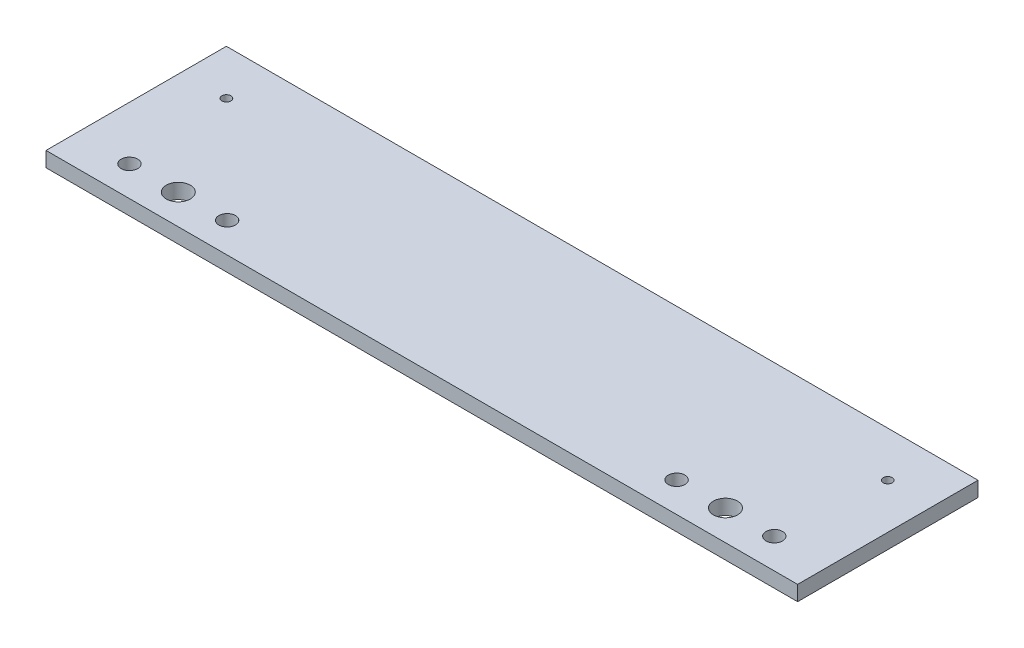
ISO-10303-21;
HEADER;
FILE_DESCRIPTION(('STEP AP214'),'2;1');
FILE_NAME('part.step','',(''),(''),'','','');
FILE_SCHEMA(('AUTOMOTIVE_DESIGN { 1 0 10303 214 1 1 1 1 }'));
ENDSEC;
DATA;
#1=APPLICATION_CONTEXT('core data for automotive mechanical design processes');
#2=APPLICATION_PROTOCOL_DEFINITION('international standard','automotive_design',2000,#1);
#3=PRODUCT_CONTEXT('',#1,'mechanical');
#4=PRODUCT('Part','Part','',(#3));
#5=PRODUCT_RELATED_PRODUCT_CATEGORY('part','',(#4));
#6=PRODUCT_DEFINITION_FORMATION('','',#4);
#7=PRODUCT_DEFINITION_CONTEXT('part definition',#1,'design');
#8=PRODUCT_DEFINITION('design','',#6,#7);
#9=PRODUCT_DEFINITION_SHAPE('','',#8);
#10=(LENGTH_UNIT() NAMED_UNIT(*) SI_UNIT(.MILLI.,.METRE.));
#11=(NAMED_UNIT(*) PLANE_ANGLE_UNIT() SI_UNIT($,.RADIAN.));
#12=(NAMED_UNIT(*) SI_UNIT($,.STERADIAN.) SOLID_ANGLE_UNIT());
#13=UNCERTAINTY_MEASURE_WITH_UNIT(LENGTH_MEASURE(1.E-05),#10,'distance_accuracy_value','');
#14=(GEOMETRIC_REPRESENTATION_CONTEXT(3) GLOBAL_UNCERTAINTY_ASSIGNED_CONTEXT((#13)) GLOBAL_UNIT_ASSIGNED_CONTEXT((#10,
#11,#12)) REPRESENTATION_CONTEXT('',''));
#15=CARTESIAN_POINT('',(0.,0.,0.));
#16=DIRECTION('',(0.,0.,1.));
#17=DIRECTION('',(1.,0.,0.));
#18=AXIS2_PLACEMENT_3D('',#15,#16,#17);
#19=CARTESIAN_POINT('',(0.,5.,0.));
#20=DIRECTION('',(0.,-1.,0.));
#21=DIRECTION('',(0.,0.,-1.));
#22=AXIS2_PLACEMENT_3D('',#19,#20,#21);
#23=PLANE('',#22);
#24=CARTESIAN_POINT('',(74.7499999999999,5.,34.9999999999999));
#25=DIRECTION('',(0.,-1.,0.));
#26=DIRECTION('',(0.,0.,-1.));
#27=AXIS2_PLACEMENT_3D('',#24,#25,#26);
#28=CIRCLE('',#27,2.75);
#29=CARTESIAN_POINT('',(74.7499999999999,5.,32.2499999999999));
#30=VERTEX_POINT('',#29);
#31=EDGE_CURVE('E121',#30,#30,#28,.T.);
#32=ORIENTED_EDGE('',*,*,#31,.T.);
#33=EDGE_LOOP('',(#32));
#34=FACE_BOUND('',#33,.T.);
#35=CARTESIAN_POINT('',(107.25,5.,34.9999999999997));
#36=DIRECTION('',(0.,-1.,0.));
#37=DIRECTION('',(0.,0.,-1.));
#38=AXIS2_PLACEMENT_3D('',#35,#36,#37);
#39=CIRCLE('',#38,2.75000000000001);
#40=CARTESIAN_POINT('',(107.25,5.,32.2499999999996));
#41=VERTEX_POINT('',#40);
#42=EDGE_CURVE('E126',#41,#41,#39,.T.);
#43=ORIENTED_EDGE('',*,*,#42,.T.);
#44=EDGE_LOOP('',(#43));
#45=FACE_BOUND('',#44,.T.);
#46=CARTESIAN_POINT('',(-110.,5.,2.41473507855972E-12));
#47=DIRECTION('',(0.,-1.,0.));
#48=DIRECTION('',(0.,0.,-1.));
#49=AXIS2_PLACEMENT_3D('',#46,#47,#48);
#50=CIRCLE('',#49,1.5);
#51=CARTESIAN_POINT('',(-110.,5.,-1.49999999999758));
#52=VERTEX_POINT('',#51);
#53=EDGE_CURVE('E129',#52,#52,#50,.T.);
#54=ORIENTED_EDGE('',*,*,#53,.T.);
#55=EDGE_LOOP('',(#54));
#56=FACE_BOUND('',#55,.T.);
#57=CARTESIAN_POINT('',(-74.7500000000001,5.,34.9999999999995));
#58=DIRECTION('',(0.,-1.,0.));
#59=DIRECTION('',(0.,0.,-1.));
#60=AXIS2_PLACEMENT_3D('',#57,#58,#59);
#61=CIRCLE('',#60,2.75000000000001);
#62=CARTESIAN_POINT('',(-74.7500000000001,5.,32.2499999999995));
#63=VERTEX_POINT('',#62);
#64=EDGE_CURVE('E132',#63,#63,#61,.T.);
#65=ORIENTED_EDGE('',*,*,#64,.T.);
#66=EDGE_LOOP('',(#65));
#67=FACE_BOUND('',#66,.T.);
#68=CARTESIAN_POINT('',(-107.25,5.,34.9999999999997));
#69=DIRECTION('',(0.,-1.,0.));
#70=DIRECTION('',(0.,0.,-1.));
#71=AXIS2_PLACEMENT_3D('',#68,#69,#70);
#72=CIRCLE('',#71,2.75000000000001);
#73=CARTESIAN_POINT('',(-107.25,5.,32.2499999999997));
#74=VERTEX_POINT('',#73);
#75=EDGE_CURVE('E135',#74,#74,#72,.T.);
#76=ORIENTED_EDGE('',*,*,#75,.T.);
#77=EDGE_LOOP('',(#76));
#78=FACE_BOUND('',#77,.T.);
#79=CARTESIAN_POINT('',(110.,5.,2.27595720048157E-12));
#80=DIRECTION('',(0.,-1.,0.));
#81=DIRECTION('',(0.,0.,-1.));
#82=AXIS2_PLACEMENT_3D('',#79,#80,#81);
#83=CIRCLE('',#82,1.5);
#84=CARTESIAN_POINT('',(110.,5.,-1.49999999999772));
#85=VERTEX_POINT('',#84);
#86=EDGE_CURVE('E138',#85,#85,#83,.T.);
#87=ORIENTED_EDGE('',*,*,#86,.T.);
#88=EDGE_LOOP('',(#87));
#89=FACE_BOUND('',#88,.T.);
#90=DIRECTION('',(0.,0.,-1.));
#91=VECTOR('',#90,1.);
#92=CARTESIAN_POINT('',(125.,5.,45.));
#93=LINE('',#92,#91);
#94=CARTESIAN_POINT('',(125.,5.,45.));
#95=VERTEX_POINT('',#94);
#96=CARTESIAN_POINT('',(125.,5.,-15.));
#97=VERTEX_POINT('',#96);
#98=EDGE_CURVE('E85',#95,#97,#93,.T.);
#99=ORIENTED_EDGE('',*,*,#98,.T.);
#100=DIRECTION('',(-1.,0.,0.));
#101=VECTOR('',#100,1.);
#102=CARTESIAN_POINT('',(-125.,5.,-15.));
#103=LINE('',#102,#101);
#104=CARTESIAN_POINT('',(-125.,5.,-15.));
#105=VERTEX_POINT('',#104);
#106=EDGE_CURVE('E80',#97,#105,#103,.T.);
#107=ORIENTED_EDGE('',*,*,#106,.T.);
#108=DIRECTION('',(0.,0.,1.));
#109=VECTOR('',#108,1.);
#110=CARTESIAN_POINT('',(-125.,5.,45.));
#111=LINE('',#110,#109);
#112=CARTESIAN_POINT('',(-125.,5.,45.));
#113=VERTEX_POINT('',#112);
#114=EDGE_CURVE('E83',#105,#113,#111,.T.);
#115=ORIENTED_EDGE('',*,*,#114,.T.);
#116=DIRECTION('',(1.,0.,0.));
#117=VECTOR('',#116,1.);
#118=CARTESIAN_POINT('',(-125.,5.,45.));
#119=LINE('',#118,#117);
#120=EDGE_CURVE('E50',#113,#95,#119,.T.);
#121=ORIENTED_EDGE('',*,*,#120,.T.);
#122=EDGE_LOOP('',(#99,#107,#115,#121));
#123=FACE_BOUND('',#122,.T.);
#124=CARTESIAN_POINT('',(-91.,5.,35.));
#125=DIRECTION('',(0.,1.,0.));
#126=DIRECTION('',(0.,0.,1.));
#127=AXIS2_PLACEMENT_3D('',#124,#125,#126);
#128=CIRCLE('',#127,4.00000000000001);
#129=CARTESIAN_POINT('',(-91.,5.,39.));
#130=VERTEX_POINT('',#129);
#131=EDGE_CURVE('E100',#130,#130,#128,.T.);
#132=ORIENTED_EDGE('',*,*,#131,.F.);
#133=EDGE_LOOP('',(#132));
#134=FACE_BOUND('',#133,.T.);
#135=CARTESIAN_POINT('',(91.,5.,35.));
#136=DIRECTION('',(0.,1.,0.));
#137=DIRECTION('',(0.,0.,-1.));
#138=AXIS2_PLACEMENT_3D('',#135,#136,#137);
#139=CIRCLE('',#138,4.00000000000001);
#140=CARTESIAN_POINT('',(91.,5.,31.));
#141=VERTEX_POINT('',#140);
#142=EDGE_CURVE('E115',#141,#141,#139,.T.);
#143=ORIENTED_EDGE('',*,*,#142,.F.);
#144=EDGE_LOOP('',(#143));
#145=FACE_BOUND('',#144,.T.);
#146=ADVANCED_FACE('F33',(#34,#45,#56,#67,#78,#89,#123,#134,#145),#23,.F.);
#147=CARTESIAN_POINT('',(0.,0.,0.));
#148=DIRECTION('',(0.,-1.,0.));
#149=DIRECTION('',(0.,0.,-1.));
#150=AXIS2_PLACEMENT_3D('',#147,#148,#149);
#151=PLANE('',#150);
#152=CARTESIAN_POINT('',(74.7499999999999,0.,34.9999999999999));
#153=DIRECTION('',(0.,-1.,0.));
#154=DIRECTION('',(0.,0.,-1.));
#155=AXIS2_PLACEMENT_3D('',#152,#153,#154);
#156=CIRCLE('',#155,2.75);
#157=CARTESIAN_POINT('',(74.7499999999999,0.,32.2499999999999));
#158=VERTEX_POINT('',#157);
#159=EDGE_CURVE('E144',#158,#158,#156,.T.);
#160=ORIENTED_EDGE('',*,*,#159,.F.);
#161=EDGE_LOOP('',(#160));
#162=FACE_BOUND('',#161,.T.);
#163=CARTESIAN_POINT('',(107.25,0.,34.9999999999997));
#164=DIRECTION('',(0.,-1.,0.));
#165=DIRECTION('',(0.,0.,-1.));
#166=AXIS2_PLACEMENT_3D('',#163,#164,#165);
#167=CIRCLE('',#166,2.75000000000001);
#168=CARTESIAN_POINT('',(107.25,0.,32.2499999999996));
#169=VERTEX_POINT('',#168);
#170=EDGE_CURVE('E152',#169,#169,#167,.T.);
#171=ORIENTED_EDGE('',*,*,#170,.F.);
#172=EDGE_LOOP('',(#171));
#173=FACE_BOUND('',#172,.T.);
#174=CARTESIAN_POINT('',(-110.,0.,2.41473507855972E-12));
#175=DIRECTION('',(0.,-1.,0.));
#176=DIRECTION('',(0.,0.,-1.));
#177=AXIS2_PLACEMENT_3D('',#174,#175,#176);
#178=CIRCLE('',#177,1.5);
#179=CARTESIAN_POINT('',(-110.,0.,-1.49999999999758));
#180=VERTEX_POINT('',#179);
#181=EDGE_CURVE('E148',#180,#180,#178,.T.);
#182=ORIENTED_EDGE('',*,*,#181,.F.);
#183=EDGE_LOOP('',(#182));
#184=FACE_BOUND('',#183,.T.);
#185=CARTESIAN_POINT('',(-74.7500000000001,0.,34.9999999999995));
#186=DIRECTION('',(0.,-1.,0.));
#187=DIRECTION('',(0.,0.,-1.));
#188=AXIS2_PLACEMENT_3D('',#185,#186,#187);
#189=CIRCLE('',#188,2.75000000000001);
#190=CARTESIAN_POINT('',(-74.7500000000001,0.,32.2499999999995));
#191=VERTEX_POINT('',#190);
#192=EDGE_CURVE('E145',#191,#191,#189,.T.);
#193=ORIENTED_EDGE('',*,*,#192,.F.);
#194=EDGE_LOOP('',(#193));
#195=FACE_BOUND('',#194,.T.);
#196=CARTESIAN_POINT('',(-107.25,0.,34.9999999999997));
#197=DIRECTION('',(0.,-1.,0.));
#198=DIRECTION('',(0.,0.,-1.));
#199=AXIS2_PLACEMENT_3D('',#196,#197,#198);
#200=CIRCLE('',#199,2.75000000000001);
#201=CARTESIAN_POINT('',(-107.25,0.,32.2499999999997));
#202=VERTEX_POINT('',#201);
#203=EDGE_CURVE('E149',#202,#202,#200,.T.);
#204=ORIENTED_EDGE('',*,*,#203,.F.);
#205=EDGE_LOOP('',(#204));
#206=FACE_BOUND('',#205,.T.);
#207=CARTESIAN_POINT('',(110.,0.,2.27595720048157E-12));
#208=DIRECTION('',(0.,-1.,0.));
#209=DIRECTION('',(0.,0.,-1.));
#210=AXIS2_PLACEMENT_3D('',#207,#208,#209);
#211=CIRCLE('',#210,1.5);
#212=CARTESIAN_POINT('',(110.,0.,-1.49999999999772));
#213=VERTEX_POINT('',#212);
#214=EDGE_CURVE('E141',#213,#213,#211,.T.);
#215=ORIENTED_EDGE('',*,*,#214,.F.);
#216=EDGE_LOOP('',(#215));
#217=FACE_BOUND('',#216,.T.);
#218=CARTESIAN_POINT('',(-91.,0.,35.));
#219=DIRECTION('',(0.,1.,0.));
#220=DIRECTION('',(0.,0.,1.));
#221=AXIS2_PLACEMENT_3D('',#218,#219,#220);
#222=CIRCLE('',#221,4.00000000000001);
#223=CARTESIAN_POINT('',(-91.,0.,39.));
#224=VERTEX_POINT('',#223);
#225=EDGE_CURVE('E112',#224,#224,#222,.T.);
#226=ORIENTED_EDGE('',*,*,#225,.T.);
#227=EDGE_LOOP('',(#226));
#228=FACE_BOUND('',#227,.T.);
#229=DIRECTION('',(0.,0.,-1.));
#230=VECTOR('',#229,1.);
#231=CARTESIAN_POINT('',(125.,0.,45.));
#232=LINE('',#231,#230);
#233=CARTESIAN_POINT('',(125.,0.,45.));
#234=VERTEX_POINT('',#233);
#235=CARTESIAN_POINT('',(125.,0.,-15.));
#236=VERTEX_POINT('',#235);
#237=EDGE_CURVE('E97',#234,#236,#232,.T.);
#238=ORIENTED_EDGE('',*,*,#237,.F.);
#239=DIRECTION('',(1.,0.,0.));
#240=VECTOR('',#239,1.);
#241=CARTESIAN_POINT('',(-125.,0.,45.));
#242=LINE('',#241,#240);
#243=CARTESIAN_POINT('',(-125.,0.,45.));
#244=VERTEX_POINT('',#243);
#245=EDGE_CURVE('E73',#244,#234,#242,.T.);
#246=ORIENTED_EDGE('',*,*,#245,.F.);
#247=DIRECTION('',(0.,0.,1.));
#248=VECTOR('',#247,1.);
#249=CARTESIAN_POINT('',(-125.,0.,45.));
#250=LINE('',#249,#248);
#251=CARTESIAN_POINT('',(-125.,0.,-15.));
#252=VERTEX_POINT('',#251);
#253=EDGE_CURVE('E67',#252,#244,#250,.T.);
#254=ORIENTED_EDGE('',*,*,#253,.F.);
#255=DIRECTION('',(-1.,0.,0.));
#256=VECTOR('',#255,1.);
#257=CARTESIAN_POINT('',(-125.,0.,-15.));
#258=LINE('',#257,#256);
#259=EDGE_CURVE('E89',#236,#252,#258,.T.);
#260=ORIENTED_EDGE('',*,*,#259,.F.);
#261=EDGE_LOOP('',(#238,#246,#254,#260));
#262=FACE_BOUND('',#261,.T.);
#263=CARTESIAN_POINT('',(91.,0.,35.));
#264=DIRECTION('',(0.,1.,0.));
#265=DIRECTION('',(0.,0.,-1.));
#266=AXIS2_PLACEMENT_3D('',#263,#264,#265);
#267=CIRCLE('',#266,4.00000000000001);
#268=CARTESIAN_POINT('',(91.,0.,31.));
#269=VERTEX_POINT('',#268);
#270=EDGE_CURVE('E118',#269,#269,#267,.T.);
#271=ORIENTED_EDGE('',*,*,#270,.T.);
#272=EDGE_LOOP('',(#271));
#273=FACE_BOUND('',#272,.T.);
#274=ADVANCED_FACE('F108',(#162,#173,#184,#195,#206,#217,#228,#262,#273),#151,.T.);
#275=CARTESIAN_POINT('',(125.,5.,45.));
#276=DIRECTION('',(-1.,0.,0.));
#277=DIRECTION('',(0.,0.,1.));
#278=AXIS2_PLACEMENT_3D('',#275,#276,#277);
#279=PLANE('',#278);
#280=ORIENTED_EDGE('',*,*,#237,.T.);
#281=DIRECTION('',(0.,-1.,0.));
#282=VECTOR('',#281,1.);
#283=CARTESIAN_POINT('',(125.,5.,-15.));
#284=LINE('',#283,#282);
#285=EDGE_CURVE('E11',#97,#236,#284,.T.);
#286=ORIENTED_EDGE('',*,*,#285,.F.);
#287=ORIENTED_EDGE('',*,*,#98,.F.);
#288=DIRECTION('',(0.,-1.,0.));
#289=VECTOR('',#288,1.);
#290=CARTESIAN_POINT('',(125.,5.,45.));
#291=LINE('',#290,#289);
#292=EDGE_CURVE('E93',#95,#234,#291,.T.);
#293=ORIENTED_EDGE('',*,*,#292,.T.);
#294=EDGE_LOOP('',(#280,#286,#287,#293));
#295=FACE_BOUND('',#294,.T.);
#296=ADVANCED_FACE('F35',(#295),#279,.F.);
#297=CARTESIAN_POINT('',(-125.,5.,-15.));
#298=DIRECTION('',(0.,0.,1.));
#299=DIRECTION('',(1.,0.,0.));
#300=AXIS2_PLACEMENT_3D('',#297,#298,#299);
#301=PLANE('',#300);
#302=ORIENTED_EDGE('',*,*,#259,.T.);
#303=DIRECTION('',(0.,-1.,0.));
#304=VECTOR('',#303,1.);
#305=CARTESIAN_POINT('',(-125.,5.,-15.));
#306=LINE('',#305,#304);
#307=EDGE_CURVE('E42',#105,#252,#306,.T.);
#308=ORIENTED_EDGE('',*,*,#307,.F.);
#309=ORIENTED_EDGE('',*,*,#106,.F.);
#310=ORIENTED_EDGE('',*,*,#285,.T.);
#311=EDGE_LOOP('',(#302,#308,#309,#310));
#312=FACE_BOUND('',#311,.T.);
#313=ADVANCED_FACE('F88',(#312),#301,.F.);
#314=CARTESIAN_POINT('',(-125.,5.,45.));
#315=DIRECTION('',(1.,0.,0.));
#316=DIRECTION('',(0.,0.,-1.));
#317=AXIS2_PLACEMENT_3D('',#314,#315,#316);
#318=PLANE('',#317);
#319=ORIENTED_EDGE('',*,*,#253,.T.);
#320=DIRECTION('',(0.,-1.,0.));
#321=VECTOR('',#320,1.);
#322=CARTESIAN_POINT('',(-125.,5.,45.));
#323=LINE('',#322,#321);
#324=EDGE_CURVE('E90',#113,#244,#323,.T.);
#325=ORIENTED_EDGE('',*,*,#324,.F.);
#326=ORIENTED_EDGE('',*,*,#114,.F.);
#327=ORIENTED_EDGE('',*,*,#307,.T.);
#328=EDGE_LOOP('',(#319,#325,#326,#327));
#329=FACE_BOUND('',#328,.T.);
#330=ADVANCED_FACE('F91',(#329),#318,.F.);
#331=CARTESIAN_POINT('',(-125.,5.,45.));
#332=DIRECTION('',(0.,0.,-1.));
#333=DIRECTION('',(-1.,0.,0.));
#334=AXIS2_PLACEMENT_3D('',#331,#332,#333);
#335=PLANE('',#334);
#336=ORIENTED_EDGE('',*,*,#245,.T.);
#337=ORIENTED_EDGE('',*,*,#292,.F.);
#338=ORIENTED_EDGE('',*,*,#120,.F.);
#339=ORIENTED_EDGE('',*,*,#324,.T.);
#340=EDGE_LOOP('',(#336,#337,#338,#339));
#341=FACE_BOUND('',#340,.T.);
#342=ADVANCED_FACE('F105',(#341),#335,.F.);
#343=CARTESIAN_POINT('',(-91.,5.,35.));
#344=DIRECTION('',(0.,-1.,0.));
#345=DIRECTION('',(0.,0.,-1.));
#346=AXIS2_PLACEMENT_3D('',#343,#344,#345);
#347=CYLINDRICAL_SURFACE('',#346,4.00000000000001);
#348=ORIENTED_EDGE('',*,*,#131,.T.);
#349=EDGE_LOOP('',(#348));
#350=FACE_BOUND('',#349,.T.);
#351=ORIENTED_EDGE('',*,*,#225,.F.);
#352=EDGE_LOOP('',(#351));
#353=FACE_BOUND('',#352,.T.);
#354=ADVANCED_FACE('F171',(#350,#353),#347,.F.);
#355=CARTESIAN_POINT('',(91.,5.,35.));
#356=DIRECTION('',(0.,-1.,0.));
#357=DIRECTION('',(0.,0.,-1.));
#358=AXIS2_PLACEMENT_3D('',#355,#356,#357);
#359=CYLINDRICAL_SURFACE('',#358,4.00000000000001);
#360=ORIENTED_EDGE('',*,*,#142,.T.);
#361=EDGE_LOOP('',(#360));
#362=FACE_BOUND('',#361,.T.);
#363=ORIENTED_EDGE('',*,*,#270,.F.);
#364=EDGE_LOOP('',(#363));
#365=FACE_BOUND('',#364,.T.);
#366=ADVANCED_FACE('F173',(#362,#365),#359,.F.);
#367=CARTESIAN_POINT('',(110.,10.,2.27595720048157E-12));
#368=DIRECTION('',(0.,-1.,0.));
#369=DIRECTION('',(0.,0.,-1.));
#370=AXIS2_PLACEMENT_3D('',#367,#368,#369);
#371=CYLINDRICAL_SURFACE('',#370,1.5);
#372=ORIENTED_EDGE('',*,*,#214,.T.);
#373=EDGE_LOOP('',(#372));
#374=FACE_BOUND('',#373,.T.);
#375=ORIENTED_EDGE('',*,*,#86,.F.);
#376=EDGE_LOOP('',(#375));
#377=FACE_BOUND('',#376,.T.);
#378=ADVANCED_FACE('F180',(#374,#377),#371,.F.);
#379=CARTESIAN_POINT('',(-107.25,10.,34.9999999999997));
#380=DIRECTION('',(0.,-1.,0.));
#381=DIRECTION('',(0.,0.,-1.));
#382=AXIS2_PLACEMENT_3D('',#379,#380,#381);
#383=CYLINDRICAL_SURFACE('',#382,2.75000000000001);
#384=ORIENTED_EDGE('',*,*,#203,.T.);
#385=EDGE_LOOP('',(#384));
#386=FACE_BOUND('',#385,.T.);
#387=ORIENTED_EDGE('',*,*,#75,.F.);
#388=EDGE_LOOP('',(#387));
#389=FACE_BOUND('',#388,.T.);
#390=ADVANCED_FACE('F160',(#386,#389),#383,.F.);
#391=CARTESIAN_POINT('',(-74.7500000000001,10.,34.9999999999995));
#392=DIRECTION('',(0.,-1.,0.));
#393=DIRECTION('',(0.,0.,-1.));
#394=AXIS2_PLACEMENT_3D('',#391,#392,#393);
#395=CYLINDRICAL_SURFACE('',#394,2.75000000000001);
#396=ORIENTED_EDGE('',*,*,#192,.T.);
#397=EDGE_LOOP('',(#396));
#398=FACE_BOUND('',#397,.T.);
#399=ORIENTED_EDGE('',*,*,#64,.F.);
#400=EDGE_LOOP('',(#399));
#401=FACE_BOUND('',#400,.T.);
#402=ADVANCED_FACE('F224',(#398,#401),#395,.F.);
#403=CARTESIAN_POINT('',(-110.,10.,2.41473507855972E-12));
#404=DIRECTION('',(0.,-1.,0.));
#405=DIRECTION('',(0.,0.,-1.));
#406=AXIS2_PLACEMENT_3D('',#403,#404,#405);
#407=CYLINDRICAL_SURFACE('',#406,1.5);
#408=ORIENTED_EDGE('',*,*,#181,.T.);
#409=EDGE_LOOP('',(#408));
#410=FACE_BOUND('',#409,.T.);
#411=ORIENTED_EDGE('',*,*,#53,.F.);
#412=EDGE_LOOP('',(#411));
#413=FACE_BOUND('',#412,.T.);
#414=ADVANCED_FACE('F233',(#410,#413),#407,.F.);
#415=CARTESIAN_POINT('',(107.25,10.,34.9999999999997));
#416=DIRECTION('',(0.,-1.,0.));
#417=DIRECTION('',(0.,0.,-1.));
#418=AXIS2_PLACEMENT_3D('',#415,#416,#417);
#419=CYLINDRICAL_SURFACE('',#418,2.75000000000001);
#420=ORIENTED_EDGE('',*,*,#170,.T.);
#421=EDGE_LOOP('',(#420));
#422=FACE_BOUND('',#421,.T.);
#423=ORIENTED_EDGE('',*,*,#42,.F.);
#424=EDGE_LOOP('',(#423));
#425=FACE_BOUND('',#424,.T.);
#426=ADVANCED_FACE('F243',(#422,#425),#419,.F.);
#427=CARTESIAN_POINT('',(74.7499999999999,10.,34.9999999999999));
#428=DIRECTION('',(0.,-1.,0.));
#429=DIRECTION('',(0.,0.,-1.));
#430=AXIS2_PLACEMENT_3D('',#427,#428,#429);
#431=CYLINDRICAL_SURFACE('',#430,2.75);
#432=ORIENTED_EDGE('',*,*,#159,.T.);
#433=EDGE_LOOP('',(#432));
#434=FACE_BOUND('',#433,.T.);
#435=ORIENTED_EDGE('',*,*,#31,.F.);
#436=EDGE_LOOP('',(#435));
#437=FACE_BOUND('',#436,.T.);
#438=ADVANCED_FACE('F253',(#434,#437),#431,.F.);
#439=CLOSED_SHELL('',(#146,#274,#296,#313,#330,#342,#354,#366,#378,#390,#402,#414,#426,#438));
#440=MANIFOLD_SOLID_BREP('B2',#439);
#441=ADVANCED_BREP_SHAPE_REPRESENTATION('',(#18,#440),#14);
#442=SHAPE_DEFINITION_REPRESENTATION(#9,#441);
ENDSEC;
END-ISO-10303-21;
